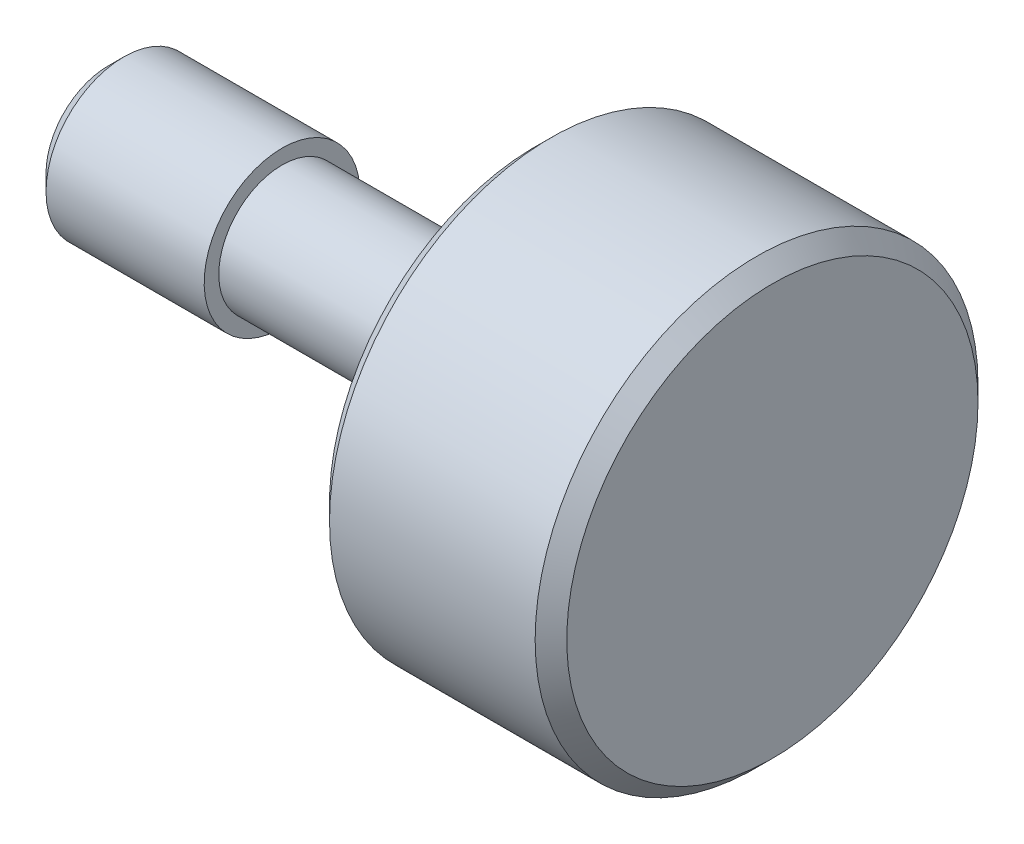
ISO-10303-21;
HEADER;
FILE_DESCRIPTION(('STEP AP214'),'2;1');
FILE_NAME('part.step','',(''),(''),'','','');
FILE_SCHEMA(('AUTOMOTIVE_DESIGN { 1 0 10303 214 1 1 1 1 }'));
ENDSEC;
DATA;
#1=APPLICATION_CONTEXT('core data for automotive mechanical design processes');
#2=APPLICATION_PROTOCOL_DEFINITION('international standard','automotive_design',2000,#1);
#3=PRODUCT_CONTEXT('',#1,'mechanical');
#4=PRODUCT('Part','Part','',(#3));
#5=PRODUCT_RELATED_PRODUCT_CATEGORY('part','',(#4));
#6=PRODUCT_DEFINITION_FORMATION('','',#4);
#7=PRODUCT_DEFINITION_CONTEXT('part definition',#1,'design');
#8=PRODUCT_DEFINITION('design','',#6,#7);
#9=PRODUCT_DEFINITION_SHAPE('','',#8);
#10=(LENGTH_UNIT() NAMED_UNIT(*) SI_UNIT(.MILLI.,.METRE.));
#11=(NAMED_UNIT(*) PLANE_ANGLE_UNIT() SI_UNIT($,.RADIAN.));
#12=(NAMED_UNIT(*) SI_UNIT($,.STERADIAN.) SOLID_ANGLE_UNIT());
#13=UNCERTAINTY_MEASURE_WITH_UNIT(LENGTH_MEASURE(1.E-05),#10,'distance_accuracy_value','');
#14=(GEOMETRIC_REPRESENTATION_CONTEXT(3) GLOBAL_UNCERTAINTY_ASSIGNED_CONTEXT((#13)) GLOBAL_UNIT_ASSIGNED_CONTEXT((#10,
#11,#12)) REPRESENTATION_CONTEXT('',''));
#15=CARTESIAN_POINT('',(0.,0.,0.));
#16=DIRECTION('',(0.,0.,1.));
#17=DIRECTION('',(1.,0.,0.));
#18=AXIS2_PLACEMENT_3D('',#15,#16,#17);
#19=CARTESIAN_POINT('',(57.,35.,8.));
#20=DIRECTION('',(-1.,0.,0.));
#21=DIRECTION('',(0.,0.,1.));
#22=AXIS2_PLACEMENT_3D('',#19,#20,#21);
#23=CYLINDRICAL_SURFACE('',#22,14.);
#24=CARTESIAN_POINT('',(56.,35.,8.));
#25=DIRECTION('',(1.,0.,0.));
#26=DIRECTION('',(0.,0.,-1.));
#27=AXIS2_PLACEMENT_3D('',#24,#25,#26);
#28=CIRCLE('',#27,14.);
#29=CARTESIAN_POINT('',(56.,35.,-5.99999999999999));
#30=VERTEX_POINT('',#29);
#31=EDGE_CURVE('E41',#30,#30,#28,.F.);
#32=ORIENTED_EDGE('',*,*,#31,.T.);
#33=EDGE_LOOP('',(#32));
#34=FACE_BOUND('',#33,.T.);
#35=CARTESIAN_POINT('',(43.,35.,8.));
#36=DIRECTION('',(1.,0.,0.));
#37=DIRECTION('',(0.,0.,-1.));
#38=AXIS2_PLACEMENT_3D('',#35,#36,#37);
#39=CIRCLE('',#38,14.);
#40=CARTESIAN_POINT('',(43.,35.,-5.99999999999999));
#41=VERTEX_POINT('',#40);
#42=EDGE_CURVE('E45',#41,#41,#39,.T.);
#43=ORIENTED_EDGE('',*,*,#42,.T.);
#44=EDGE_LOOP('',(#43));
#45=FACE_BOUND('',#44,.T.);
#46=ADVANCED_FACE('F34',(#34,#45),#23,.T.);
#47=CARTESIAN_POINT('',(57.,35.,8.));
#48=DIRECTION('',(1.,0.,0.));
#49=DIRECTION('',(0.,0.,-1.));
#50=AXIS2_PLACEMENT_3D('',#47,#48,#49);
#51=PLANE('',#50);
#52=CARTESIAN_POINT('',(57.,35.,8.));
#53=DIRECTION('',(1.,0.,0.));
#54=DIRECTION('',(0.,0.,-1.));
#55=AXIS2_PLACEMENT_3D('',#52,#53,#54);
#56=CIRCLE('',#55,13.);
#57=CARTESIAN_POINT('',(57.,35.,-4.99999999999999));
#58=VERTEX_POINT('',#57);
#59=EDGE_CURVE('E49',#58,#58,#56,.T.);
#60=ORIENTED_EDGE('',*,*,#59,.T.);
#61=EDGE_LOOP('',(#60));
#62=FACE_BOUND('',#61,.T.);
#63=ADVANCED_FACE('F88',(#62),#51,.T.);
#64=CARTESIAN_POINT('',(42.,35.,8.));
#65=DIRECTION('',(1.,0.,0.));
#66=DIRECTION('',(0.,0.,-1.));
#67=AXIS2_PLACEMENT_3D('',#64,#65,#66);
#68=PLANE('',#67);
#69=CARTESIAN_POINT('',(42.,35.,8.));
#70=DIRECTION('',(1.,0.,0.));
#71=DIRECTION('',(0.,0.,-1.));
#72=AXIS2_PLACEMENT_3D('',#69,#70,#71);
#73=CIRCLE('',#72,13.);
#74=CARTESIAN_POINT('',(42.,35.,-4.99999999999998));
#75=VERTEX_POINT('',#74);
#76=EDGE_CURVE('E10',#75,#75,#73,.F.);
#77=ORIENTED_EDGE('',*,*,#76,.T.);
#78=EDGE_LOOP('',(#77));
#79=FACE_BOUND('',#78,.T.);
#80=CARTESIAN_POINT('',(42.,35.,8.00000000000001));
#81=DIRECTION('',(1.,0.,0.));
#82=DIRECTION('',(0.,1.,0.));
#83=AXIS2_PLACEMENT_3D('',#80,#81,#82);
#84=CIRCLE('',#83,3.99999999999999);
#85=CARTESIAN_POINT('',(42.,39.,8.00000000000001));
#86=VERTEX_POINT('',#85);
#87=EDGE_CURVE('E66',#86,#86,#84,.T.);
#88=ORIENTED_EDGE('',*,*,#87,.T.);
#89=EDGE_LOOP('',(#88));
#90=FACE_BOUND('',#89,.T.);
#91=ADVANCED_FACE('F70',(#79,#90),#68,.F.);
#92=CARTESIAN_POINT('',(26.,35.,12.925));
#93=DIRECTION('',(1.,0.,0.));
#94=DIRECTION('',(0.,1.,0.));
#95=AXIS2_PLACEMENT_3D('',#92,#93,#94);
#96=PLANE('',#95);
#97=CARTESIAN_POINT('',(26.,35.,8.00000000000001));
#98=DIRECTION('',(1.,0.,0.));
#99=DIRECTION('',(0.,1.,0.));
#100=AXIS2_PLACEMENT_3D('',#97,#98,#99);
#101=CIRCLE('',#100,4.925);
#102=CARTESIAN_POINT('',(26.,39.925,8.00000000000001));
#103=VERTEX_POINT('',#102);
#104=EDGE_CURVE('E60',#103,#103,#101,.T.);
#105=ORIENTED_EDGE('',*,*,#104,.T.);
#106=EDGE_LOOP('',(#105));
#107=FACE_BOUND('',#106,.T.);
#108=CARTESIAN_POINT('',(26.,35.,8.00000000000001));
#109=DIRECTION('',(1.,0.,0.));
#110=DIRECTION('',(0.,1.,0.));
#111=AXIS2_PLACEMENT_3D('',#108,#109,#110);
#112=CIRCLE('',#111,3.99999999999999);
#113=CARTESIAN_POINT('',(26.,39.,8.00000000000001));
#114=VERTEX_POINT('',#113);
#115=EDGE_CURVE('E63',#114,#114,#112,.T.);
#116=ORIENTED_EDGE('',*,*,#115,.F.);
#117=EDGE_LOOP('',(#116));
#118=FACE_BOUND('',#117,.T.);
#119=ADVANCED_FACE('F75',(#107,#118),#96,.T.);
#120=CARTESIAN_POINT('',(57.,35.,8.00000000000001));
#121=DIRECTION('',(1.,0.,0.));
#122=DIRECTION('',(0.,1.,0.));
#123=AXIS2_PLACEMENT_3D('',#120,#121,#122);
#124=CYLINDRICAL_SURFACE('',#123,3.99999999999999);
#125=ORIENTED_EDGE('',*,*,#115,.T.);
#126=EDGE_LOOP('',(#125));
#127=FACE_BOUND('',#126,.T.);
#128=ORIENTED_EDGE('',*,*,#87,.F.);
#129=EDGE_LOOP('',(#128));
#130=FACE_BOUND('',#129,.T.);
#131=ADVANCED_FACE('F72',(#127,#130),#124,.T.);
#132=CARTESIAN_POINT('',(15.,35.,8.));
#133=DIRECTION('',(-1.,0.,0.));
#134=DIRECTION('',(0.,0.,1.));
#135=AXIS2_PLACEMENT_3D('',#132,#133,#134);
#136=PLANE('',#135);
#137=CARTESIAN_POINT('',(15.,35.,8.));
#138=DIRECTION('',(-1.,0.,0.));
#139=DIRECTION('',(0.,0.,1.));
#140=AXIS2_PLACEMENT_3D('',#137,#138,#139);
#141=CIRCLE('',#140,3.92499999999999);
#142=CARTESIAN_POINT('',(15.,35.,11.925));
#143=VERTEX_POINT('',#142);
#144=EDGE_CURVE('E57',#143,#143,#141,.T.);
#145=ORIENTED_EDGE('',*,*,#144,.T.);
#146=EDGE_LOOP('',(#145));
#147=FACE_BOUND('',#146,.T.);
#148=ADVANCED_FACE('F74',(#147),#136,.T.);
#149=CARTESIAN_POINT('',(15.,35.,8.));
#150=DIRECTION('',(1.,0.,0.));
#151=DIRECTION('',(0.,0.,-1.));
#152=AXIS2_PLACEMENT_3D('',#149,#150,#151);
#153=CYLINDRICAL_SURFACE('',#152,4.925);
#154=CARTESIAN_POINT('',(16.,35.,8.));
#155=DIRECTION('',(-1.,0.,0.));
#156=DIRECTION('',(0.,0.,1.));
#157=AXIS2_PLACEMENT_3D('',#154,#155,#156);
#158=CIRCLE('',#157,4.925);
#159=CARTESIAN_POINT('',(16.,35.,12.925));
#160=VERTEX_POINT('',#159);
#161=EDGE_CURVE('E54',#160,#160,#158,.F.);
#162=ORIENTED_EDGE('',*,*,#161,.T.);
#163=EDGE_LOOP('',(#162));
#164=FACE_BOUND('',#163,.T.);
#165=ORIENTED_EDGE('',*,*,#104,.F.);
#166=EDGE_LOOP('',(#165));
#167=FACE_BOUND('',#166,.T.);
#168=ADVANCED_FACE('F82',(#164,#167),#153,.T.);
#169=CARTESIAN_POINT('',(15.,35.,8.));
#170=DIRECTION('',(1.,0.,0.));
#171=DIRECTION('',(0.,0.,-1.));
#172=AXIS2_PLACEMENT_3D('',#169,#170,#171);
#173=CONICAL_SURFACE('',#172,3.92499999999999,0.785398163397447);
#174=ORIENTED_EDGE('',*,*,#161,.F.);
#175=EDGE_LOOP('',(#174));
#176=FACE_BOUND('',#175,.T.);
#177=ORIENTED_EDGE('',*,*,#144,.F.);
#178=EDGE_LOOP('',(#177));
#179=FACE_BOUND('',#178,.T.);
#180=ADVANCED_FACE('F98',(#176,#179),#173,.T.);
#181=CARTESIAN_POINT('',(57.,35.,8.));
#182=DIRECTION('',(-1.,0.,0.));
#183=DIRECTION('',(0.,0.,1.));
#184=AXIS2_PLACEMENT_3D('',#181,#182,#183);
#185=CONICAL_SURFACE('',#184,13.,0.785398163397445);
#186=ORIENTED_EDGE('',*,*,#31,.F.);
#187=EDGE_LOOP('',(#186));
#188=FACE_BOUND('',#187,.T.);
#189=ORIENTED_EDGE('',*,*,#59,.F.);
#190=EDGE_LOOP('',(#189));
#191=FACE_BOUND('',#190,.T.);
#192=ADVANCED_FACE('F100',(#188,#191),#185,.T.);
#193=CARTESIAN_POINT('',(43.,35.,8.));
#194=DIRECTION('',(1.,0.,0.));
#195=DIRECTION('',(0.,0.,-1.));
#196=AXIS2_PLACEMENT_3D('',#193,#194,#195);
#197=CONICAL_SURFACE('',#196,14.,0.78539816339745);
#198=ORIENTED_EDGE('',*,*,#76,.F.);
#199=EDGE_LOOP('',(#198));
#200=FACE_BOUND('',#199,.T.);
#201=ORIENTED_EDGE('',*,*,#42,.F.);
#202=EDGE_LOOP('',(#201));
#203=FACE_BOUND('',#202,.T.);
#204=ADVANCED_FACE('F36',(#200,#203),#197,.T.);
#205=CLOSED_SHELL('',(#46,#63,#91,#119,#131,#148,#168,#180,#192,#204));
#206=MANIFOLD_SOLID_BREP('B2',#205);
#207=ADVANCED_BREP_SHAPE_REPRESENTATION('',(#18,#206),#14);
#208=SHAPE_DEFINITION_REPRESENTATION(#9,#207);
ENDSEC;
END-ISO-10303-21;
